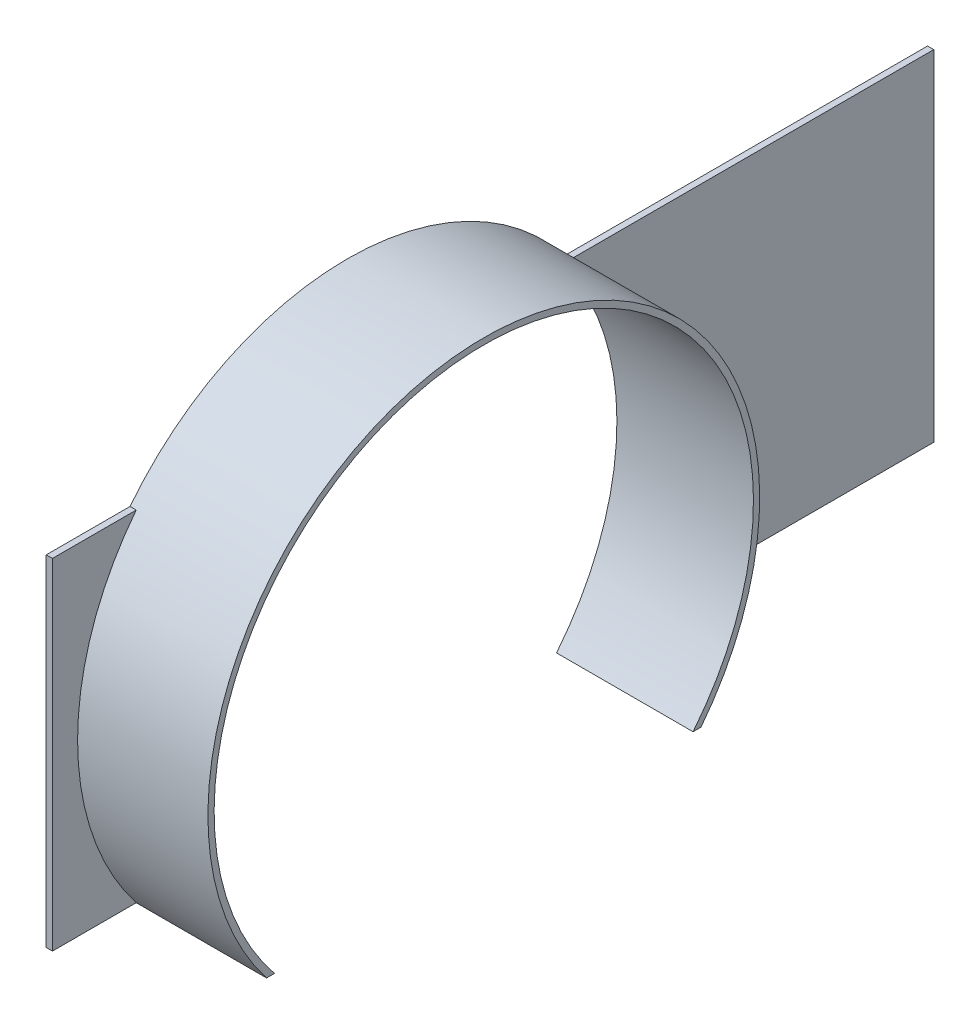
ISO-10303-21;
HEADER;
FILE_DESCRIPTION(('STEP AP214'),'2;1');
FILE_NAME('part.step','',(''),(''),'','','');
FILE_SCHEMA(('AUTOMOTIVE_DESIGN { 1 0 10303 214 1 1 1 1 }'));
ENDSEC;
DATA;
#1=APPLICATION_CONTEXT('core data for automotive mechanical design processes');
#2=APPLICATION_PROTOCOL_DEFINITION('international standard','automotive_design',2000,#1);
#3=PRODUCT_CONTEXT('',#1,'mechanical');
#4=PRODUCT('Part','Part','',(#3));
#5=PRODUCT_RELATED_PRODUCT_CATEGORY('part','',(#4));
#6=PRODUCT_DEFINITION_FORMATION('','',#4);
#7=PRODUCT_DEFINITION_CONTEXT('part definition',#1,'design');
#8=PRODUCT_DEFINITION('design','',#6,#7);
#9=PRODUCT_DEFINITION_SHAPE('','',#8);
#10=(LENGTH_UNIT() NAMED_UNIT(*) SI_UNIT(.MILLI.,.METRE.));
#11=(NAMED_UNIT(*) PLANE_ANGLE_UNIT() SI_UNIT($,.RADIAN.));
#12=(NAMED_UNIT(*) SI_UNIT($,.STERADIAN.) SOLID_ANGLE_UNIT());
#13=UNCERTAINTY_MEASURE_WITH_UNIT(LENGTH_MEASURE(1.E-05),#10,'distance_accuracy_value','');
#14=(GEOMETRIC_REPRESENTATION_CONTEXT(3) GLOBAL_UNCERTAINTY_ASSIGNED_CONTEXT((#13)) GLOBAL_UNIT_ASSIGNED_CONTEXT((#10,
#11,#12)) REPRESENTATION_CONTEXT('',''));
#15=CARTESIAN_POINT('',(0.,0.,0.));
#16=DIRECTION('',(0.,0.,1.));
#17=DIRECTION('',(1.,0.,0.));
#18=AXIS2_PLACEMENT_3D('',#15,#16,#17);
#19=CARTESIAN_POINT('',(42.000000074,54.7999999999982,25.));
#20=DIRECTION('',(-1.,0.,0.));
#21=DIRECTION('',(0.,0.,1.));
#22=AXIS2_PLACEMENT_3D('',#19,#20,#21);
#23=CYLINDRICAL_SURFACE('',#22,86.899999936);
#24=DIRECTION('',(-1.,0.,0.));
#25=VECTOR('',#24,1.);
#26=CARTESIAN_POINT('',(42.000000074,0.,92.4430870354923));
#27=LINE('',#26,#25);
#28=CARTESIAN_POINT('',(42.000000074,0.,92.4430870354923));
#29=VERTEX_POINT('',#28);
#30=CARTESIAN_POINT('',(-2.000000064,0.,92.4430870354923));
#31=VERTEX_POINT('',#30);
#32=EDGE_CURVE('E38',#29,#31,#27,.T.);
#33=ORIENTED_EDGE('',*,*,#32,.T.);
#34=CARTESIAN_POINT('',(-2.000000064,54.7999999999982,25.));
#35=DIRECTION('',(1.,0.,0.));
#36=DIRECTION('',(0.,0.,-1.));
#37=AXIS2_PLACEMENT_3D('',#34,#35,#36);
#38=CIRCLE('',#37,86.899999936);
#39=CARTESIAN_POINT('',(-2.000000064,0.,-42.4430870354924));
#40=VERTEX_POINT('',#39);
#41=EDGE_CURVE('E144',#40,#31,#38,.T.);
#42=ORIENTED_EDGE('',*,*,#41,.F.);
#43=DIRECTION('',(-1.,0.,0.));
#44=VECTOR('',#43,1.);
#45=CARTESIAN_POINT('',(42.000000074,0.,-42.4430870354924));
#46=LINE('',#45,#44);
#47=CARTESIAN_POINT('',(42.000000074,0.,-42.4430870354924));
#48=VERTEX_POINT('',#47);
#49=EDGE_CURVE('E11',#48,#40,#46,.T.);
#50=ORIENTED_EDGE('',*,*,#49,.F.);
#51=CARTESIAN_POINT('',(42.000000074,54.7999999999982,25.));
#52=DIRECTION('',(1.,0.,0.));
#53=DIRECTION('',(0.,0.,-1.));
#54=AXIS2_PLACEMENT_3D('',#51,#52,#53);
#55=CIRCLE('',#54,86.899999936);
#56=EDGE_CURVE('E174',#48,#29,#55,.T.);
#57=ORIENTED_EDGE('',*,*,#56,.T.);
#58=EDGE_LOOP('',(#33,#42,#50,#57));
#59=FACE_BOUND('',#58,.T.);
#60=ADVANCED_FACE('F35',(#59),#23,.F.);
#61=CARTESIAN_POINT('',(42.000000074,0.,-45.0012142751838));
#62=DIRECTION('',(0.,-1.,0.));
#63=DIRECTION('',(0.,0.,-1.));
#64=AXIS2_PLACEMENT_3D('',#61,#62,#63);
#65=PLANE('',#64);
#66=ORIENTED_EDGE('',*,*,#49,.T.);
#67=DIRECTION('',(0.,0.,-1.));
#68=VECTOR('',#67,1.);
#69=CARTESIAN_POINT('',(-2.000000064,0.,0.));
#70=LINE('',#69,#68);
#71=CARTESIAN_POINT('',(-2.000000064,3.6166950094158E-12,-162.000000064));
#72=VERTEX_POINT('',#71);
#73=EDGE_CURVE('E147',#40,#72,#70,.T.);
#74=ORIENTED_EDGE('',*,*,#73,.T.);
#75=DIRECTION('',(1.,0.,0.));
#76=VECTOR('',#75,1.);
#77=CARTESIAN_POINT('',(-2.000000064,3.6166950094158E-12,-162.000000064));
#78=LINE('',#77,#76);
#79=CARTESIAN_POINT('',(0.,3.6166950094158E-12,-162.000000064));
#80=VERTEX_POINT('',#79);
#81=EDGE_CURVE('E167',#72,#80,#78,.T.);
#82=ORIENTED_EDGE('',*,*,#81,.T.);
#83=DIRECTION('',(0.,0.,-1.));
#84=VECTOR('',#83,1.);
#85=CARTESIAN_POINT('',(0.,0.,0.));
#86=LINE('',#85,#84);
#87=CARTESIAN_POINT('',(0.,0.,-45.0012142751838));
#88=VERTEX_POINT('',#87);
#89=EDGE_CURVE('E160',#88,#80,#86,.T.);
#90=ORIENTED_EDGE('',*,*,#89,.F.);
#91=DIRECTION('',(-1.,0.,0.));
#92=VECTOR('',#91,1.);
#93=CARTESIAN_POINT('',(42.000000074,0.,-45.0012142751838));
#94=LINE('',#93,#92);
#95=CARTESIAN_POINT('',(42.000000074,0.,-45.0012142751838));
#96=VERTEX_POINT('',#95);
#97=EDGE_CURVE('E43',#96,#88,#94,.T.);
#98=ORIENTED_EDGE('',*,*,#97,.F.);
#99=DIRECTION('',(0.,0.,1.));
#100=VECTOR('',#99,1.);
#101=CARTESIAN_POINT('',(42.000000074,0.,-45.0012142751838));
#102=LINE('',#101,#100);
#103=EDGE_CURVE('E183',#96,#48,#102,.T.);
#104=ORIENTED_EDGE('',*,*,#103,.T.);
#105=EDGE_LOOP('',(#66,#74,#82,#90,#98,#104));
#106=FACE_BOUND('',#105,.T.);
#107=ADVANCED_FACE('F220',(#106),#65,.T.);
#108=CARTESIAN_POINT('',(42.000000074,54.7999999999982,25.));
#109=DIRECTION('',(-1.,0.,0.));
#110=DIRECTION('',(0.,0.,1.));
#111=AXIS2_PLACEMENT_3D('',#108,#109,#110);
#112=CYLINDRICAL_SURFACE('',#111,88.9);
#113=CARTESIAN_POINT('',(0.,54.7999999999982,25.));
#114=DIRECTION('',(-1.,0.,0.));
#115=DIRECTION('',(0.,0.,-1.));
#116=AXIS2_PLACEMENT_3D('',#113,#114,#115);
#117=CIRCLE('',#116,88.9);
#118=CARTESIAN_POINT('',(0.,0.,95.0012142751838));
#119=VERTEX_POINT('',#118);
#120=CARTESIAN_POINT('',(0.,109.599999999998,95.0012142751821));
#121=VERTEX_POINT('',#120);
#122=EDGE_CURVE('E59',#119,#121,#117,.T.);
#123=ORIENTED_EDGE('',*,*,#122,.F.);
#124=DIRECTION('',(-1.,0.,0.));
#125=VECTOR('',#124,1.);
#126=CARTESIAN_POINT('',(42.000000074,0.,95.0012142751838));
#127=LINE('',#126,#125);
#128=CARTESIAN_POINT('',(42.000000074,0.,95.0012142751838));
#129=VERTEX_POINT('',#128);
#130=EDGE_CURVE('E187',#129,#119,#127,.T.);
#131=ORIENTED_EDGE('',*,*,#130,.F.);
#132=CARTESIAN_POINT('',(42.000000074,54.7999999999982,25.));
#133=DIRECTION('',(-1.,0.,0.));
#134=DIRECTION('',(0.,0.,-1.));
#135=AXIS2_PLACEMENT_3D('',#132,#133,#134);
#136=CIRCLE('',#135,88.9);
#137=EDGE_CURVE('E180',#129,#96,#136,.T.);
#138=ORIENTED_EDGE('',*,*,#137,.T.);
#139=ORIENTED_EDGE('',*,*,#97,.T.);
#140=CARTESIAN_POINT('',(0.,109.600000000002,-45.0012142751796));
#141=VERTEX_POINT('',#140);
#142=EDGE_CURVE('E51',#141,#88,#117,.T.);
#143=ORIENTED_EDGE('',*,*,#142,.F.);
#144=DIRECTION('',(1.,0.,0.));
#145=VECTOR('',#144,1.);
#146=CARTESIAN_POINT('',(-2.000000064,109.600000000001,-45.0012142751814));
#147=LINE('',#146,#145);
#148=CARTESIAN_POINT('',(-2.000000064,109.600000000001,-45.0012142751814));
#149=VERTEX_POINT('',#148);
#150=EDGE_CURVE('E134',#149,#141,#147,.T.);
#151=ORIENTED_EDGE('',*,*,#150,.F.);
#152=CARTESIAN_POINT('',(-2.000000064,54.7999999999982,25.));
#153=DIRECTION('',(1.,0.,0.));
#154=DIRECTION('',(0.,0.,-1.));
#155=AXIS2_PLACEMENT_3D('',#152,#153,#154);
#156=CIRCLE('',#155,88.9);
#157=CARTESIAN_POINT('',(-2.000000064,109.599999999998,95.0012142751822));
#158=VERTEX_POINT('',#157);
#159=EDGE_CURVE('E128',#149,#158,#156,.T.);
#160=ORIENTED_EDGE('',*,*,#159,.T.);
#161=DIRECTION('',(1.,0.,0.));
#162=VECTOR('',#161,1.);
#163=CARTESIAN_POINT('',(-2.000000064,109.599999999998,95.0012142751822));
#164=LINE('',#163,#162);
#165=EDGE_CURVE('E114',#158,#121,#164,.T.);
#166=ORIENTED_EDGE('',*,*,#165,.T.);
#167=EDGE_LOOP('',(#123,#131,#138,#139,#143,#151,#160,#166));
#168=FACE_BOUND('',#167,.T.);
#169=ADVANCED_FACE('F133',(#168),#112,.T.);
#170=CARTESIAN_POINT('',(42.000000074,0.,92.4430870354923));
#171=DIRECTION('',(0.,-1.,0.));
#172=DIRECTION('',(0.,0.,-1.));
#173=AXIS2_PLACEMENT_3D('',#170,#171,#172);
#174=PLANE('',#173);
#175=ORIENTED_EDGE('',*,*,#130,.T.);
#176=DIRECTION('',(0.,-7.106723131739E-13,1.));
#177=VECTOR('',#176,1.);
#178=CARTESIAN_POINT('',(0.,6.56898036065456E-11,0.));
#179=LINE('',#178,#177);
#180=CARTESIAN_POINT('',(0.,-1.04744440334534E-12,122.000000064));
#181=VERTEX_POINT('',#180);
#182=EDGE_CURVE('E158',#119,#181,#179,.T.);
#183=ORIENTED_EDGE('',*,*,#182,.T.);
#184=DIRECTION('',(1.,0.,0.));
#185=VECTOR('',#184,1.);
#186=CARTESIAN_POINT('',(-2.000000064,-1.04744440334534E-12,122.000000064));
#187=LINE('',#186,#185);
#188=CARTESIAN_POINT('',(-2.000000064,-1.04744440334534E-12,122.000000064));
#189=VERTEX_POINT('',#188);
#190=EDGE_CURVE('E170',#189,#181,#187,.T.);
#191=ORIENTED_EDGE('',*,*,#190,.F.);
#192=DIRECTION('',(0.,-7.106723131739E-13,1.));
#193=VECTOR('',#192,1.);
#194=CARTESIAN_POINT('',(-2.000000064,6.56898036065456E-11,0.));
#195=LINE('',#194,#193);
#196=EDGE_CURVE('E142',#31,#189,#195,.T.);
#197=ORIENTED_EDGE('',*,*,#196,.F.);
#198=ORIENTED_EDGE('',*,*,#32,.F.);
#199=DIRECTION('',(0.,0.,1.));
#200=VECTOR('',#199,1.);
#201=CARTESIAN_POINT('',(42.000000074,0.,92.4430870354923));
#202=LINE('',#201,#200);
#203=EDGE_CURVE('E177',#29,#129,#202,.T.);
#204=ORIENTED_EDGE('',*,*,#203,.T.);
#205=EDGE_LOOP('',(#175,#183,#191,#197,#198,#204));
#206=FACE_BOUND('',#205,.T.);
#207=ADVANCED_FACE('F197',(#206),#174,.T.);
#208=CARTESIAN_POINT('',(42.000000074,54.7999999999982,25.));
#209=DIRECTION('',(1.,0.,0.));
#210=DIRECTION('',(0.,0.,-1.));
#211=AXIS2_PLACEMENT_3D('',#208,#209,#210);
#212=PLANE('',#211);
#213=ORIENTED_EDGE('',*,*,#56,.F.);
#214=ORIENTED_EDGE('',*,*,#103,.F.);
#215=ORIENTED_EDGE('',*,*,#137,.F.);
#216=ORIENTED_EDGE('',*,*,#203,.F.);
#217=EDGE_LOOP('',(#213,#214,#215,#216));
#218=FACE_BOUND('',#217,.T.);
#219=ADVANCED_FACE('F204',(#218),#212,.T.);
#220=CARTESIAN_POINT('',(0.,0.,0.));
#221=DIRECTION('',(1.,0.,0.));
#222=DIRECTION('',(0.,0.,-1.));
#223=AXIS2_PLACEMENT_3D('',#220,#221,#222);
#224=PLANE('',#223);
#225=ORIENTED_EDGE('',*,*,#182,.F.);
#226=ORIENTED_EDGE('',*,*,#122,.T.);
#227=DIRECTION('',(0.,0.,1.));
#228=VECTOR('',#227,1.);
#229=CARTESIAN_POINT('',(0.,109.6,1.27770671624085E-12));
#230=LINE('',#229,#228);
#231=CARTESIAN_POINT('',(0.,109.599999999999,122.000000064));
#232=VERTEX_POINT('',#231);
#233=EDGE_CURVE('E118',#121,#232,#230,.T.);
#234=ORIENTED_EDGE('',*,*,#233,.T.);
#235=DIRECTION('',(0.,-1.,0.));
#236=VECTOR('',#235,1.);
#237=CARTESIAN_POINT('',(0.,0.,122.000000064));
#238=LINE('',#237,#236);
#239=EDGE_CURVE('E155',#232,#181,#238,.T.);
#240=ORIENTED_EDGE('',*,*,#239,.T.);
#241=EDGE_LOOP('',(#225,#226,#234,#240));
#242=FACE_BOUND('',#241,.T.);
#243=ADVANCED_FACE('F201',(#242),#224,.T.);
#244=CARTESIAN_POINT('',(-2.000000064,109.600000000002,0.));
#245=DIRECTION('',(0.,1.,0.));
#246=DIRECTION('',(0.,0.,1.));
#247=AXIS2_PLACEMENT_3D('',#244,#245,#246);
#248=PLANE('',#247);
#249=DIRECTION('',(0.,0.,1.));
#250=VECTOR('',#249,1.);
#251=CARTESIAN_POINT('',(0.,109.600000000002,0.));
#252=LINE('',#251,#250);
#253=CARTESIAN_POINT('',(0.,109.600000000002,-162.000000064));
#254=VERTEX_POINT('',#253);
#255=EDGE_CURVE('E135',#254,#141,#252,.T.);
#256=ORIENTED_EDGE('',*,*,#255,.F.);
#257=DIRECTION('',(1.,0.,0.));
#258=VECTOR('',#257,1.);
#259=CARTESIAN_POINT('',(-2.000000064,109.600000000002,-162.000000064));
#260=LINE('',#259,#258);
#261=CARTESIAN_POINT('',(-2.000000064,109.600000000002,-162.000000064));
#262=VERTEX_POINT('',#261);
#263=EDGE_CURVE('E165',#262,#254,#260,.T.);
#264=ORIENTED_EDGE('',*,*,#263,.F.);
#265=DIRECTION('',(0.,0.,1.));
#266=VECTOR('',#265,1.);
#267=CARTESIAN_POINT('',(-2.000000064,109.600000000002,0.));
#268=LINE('',#267,#266);
#269=EDGE_CURVE('E121',#262,#149,#268,.T.);
#270=ORIENTED_EDGE('',*,*,#269,.T.);
#271=ORIENTED_EDGE('',*,*,#150,.T.);
#272=EDGE_LOOP('',(#256,#264,#270,#271));
#273=FACE_BOUND('',#272,.T.);
#274=ADVANCED_FACE('F203',(#273),#248,.T.);
#275=CARTESIAN_POINT('',(-2.000000064,0.,-162.000000064));
#276=DIRECTION('',(0.,0.,-1.));
#277=DIRECTION('',(-1.,0.,0.));
#278=AXIS2_PLACEMENT_3D('',#275,#276,#277);
#279=PLANE('',#278);
#280=DIRECTION('',(0.,1.,0.));
#281=VECTOR('',#280,1.);
#282=CARTESIAN_POINT('',(0.,0.,-162.000000064));
#283=LINE('',#282,#281);
#284=EDGE_CURVE('E138',#80,#254,#283,.T.);
#285=ORIENTED_EDGE('',*,*,#284,.F.);
#286=ORIENTED_EDGE('',*,*,#81,.F.);
#287=DIRECTION('',(0.,1.,0.));
#288=VECTOR('',#287,1.);
#289=CARTESIAN_POINT('',(-2.000000064,0.,-162.000000064));
#290=LINE('',#289,#288);
#291=EDGE_CURVE('E150',#72,#262,#290,.T.);
#292=ORIENTED_EDGE('',*,*,#291,.T.);
#293=ORIENTED_EDGE('',*,*,#263,.T.);
#294=EDGE_LOOP('',(#285,#286,#292,#293));
#295=FACE_BOUND('',#294,.T.);
#296=ADVANCED_FACE('F211',(#295),#279,.T.);
#297=CARTESIAN_POINT('',(-2.000000064,0.,122.000000064));
#298=DIRECTION('',(0.,0.,1.));
#299=DIRECTION('',(0.,-1.,0.));
#300=AXIS2_PLACEMENT_3D('',#297,#298,#299);
#301=PLANE('',#300);
#302=ORIENTED_EDGE('',*,*,#239,.F.);
#303=DIRECTION('',(1.,0.,0.));
#304=VECTOR('',#303,1.);
#305=CARTESIAN_POINT('',(-2.000000064,109.599999999999,122.000000064));
#306=LINE('',#305,#304);
#307=CARTESIAN_POINT('',(-2.000000064,109.599999999999,122.000000064));
#308=VERTEX_POINT('',#307);
#309=EDGE_CURVE('E120',#308,#232,#306,.T.);
#310=ORIENTED_EDGE('',*,*,#309,.F.);
#311=DIRECTION('',(0.,-1.,0.));
#312=VECTOR('',#311,1.);
#313=CARTESIAN_POINT('',(-2.000000064,0.,122.000000064));
#314=LINE('',#313,#312);
#315=EDGE_CURVE('E131',#308,#189,#314,.T.);
#316=ORIENTED_EDGE('',*,*,#315,.T.);
#317=ORIENTED_EDGE('',*,*,#190,.T.);
#318=EDGE_LOOP('',(#302,#310,#316,#317));
#319=FACE_BOUND('',#318,.T.);
#320=ADVANCED_FACE('F200',(#319),#301,.T.);
#321=CARTESIAN_POINT('',(-2.000000064,109.6,1.27770671624085E-12));
#322=DIRECTION('',(0.,1.,0.));
#323=DIRECTION('',(0.,0.,1.));
#324=AXIS2_PLACEMENT_3D('',#321,#322,#323);
#325=PLANE('',#324);
#326=ORIENTED_EDGE('',*,*,#233,.F.);
#327=ORIENTED_EDGE('',*,*,#165,.F.);
#328=DIRECTION('',(0.,0.,1.));
#329=VECTOR('',#328,1.);
#330=CARTESIAN_POINT('',(-2.000000064,109.6,1.27770671624085E-12));
#331=LINE('',#330,#329);
#332=EDGE_CURVE('E117',#158,#308,#331,.T.);
#333=ORIENTED_EDGE('',*,*,#332,.T.);
#334=ORIENTED_EDGE('',*,*,#309,.T.);
#335=EDGE_LOOP('',(#326,#327,#333,#334));
#336=FACE_BOUND('',#335,.T.);
#337=ADVANCED_FACE('F116',(#336),#325,.T.);
#338=CARTESIAN_POINT('',(-2.000000064,0.,0.));
#339=DIRECTION('',(1.,0.,0.));
#340=DIRECTION('',(0.,0.,-1.));
#341=AXIS2_PLACEMENT_3D('',#338,#339,#340);
#342=PLANE('',#341);
#343=ORIENTED_EDGE('',*,*,#159,.F.);
#344=ORIENTED_EDGE('',*,*,#269,.F.);
#345=ORIENTED_EDGE('',*,*,#291,.F.);
#346=ORIENTED_EDGE('',*,*,#73,.F.);
#347=ORIENTED_EDGE('',*,*,#41,.T.);
#348=ORIENTED_EDGE('',*,*,#196,.T.);
#349=ORIENTED_EDGE('',*,*,#315,.F.);
#350=ORIENTED_EDGE('',*,*,#332,.F.);
#351=EDGE_LOOP('',(#343,#344,#345,#346,#347,#348,#349,#350));
#352=FACE_BOUND('',#351,.T.);
#353=ADVANCED_FACE('F126',(#352),#342,.F.);
#354=ORIENTED_EDGE('',*,*,#255,.T.);
#355=ORIENTED_EDGE('',*,*,#142,.T.);
#356=ORIENTED_EDGE('',*,*,#89,.T.);
#357=ORIENTED_EDGE('',*,*,#284,.T.);
#358=EDGE_LOOP('',(#354,#355,#356,#357));
#359=FACE_BOUND('',#358,.T.);
#360=ADVANCED_FACE('F206',(#359),#224,.T.);
#361=CLOSED_SHELL('',(#60,#107,#169,#207,#219,#243,#274,#296,#320,#337,#353,#360));
#362=MANIFOLD_SOLID_BREP('B2',#361);
#363=ADVANCED_BREP_SHAPE_REPRESENTATION('',(#18,#362),#14);
#364=SHAPE_DEFINITION_REPRESENTATION(#9,#363);
ENDSEC;
END-ISO-10303-21;
